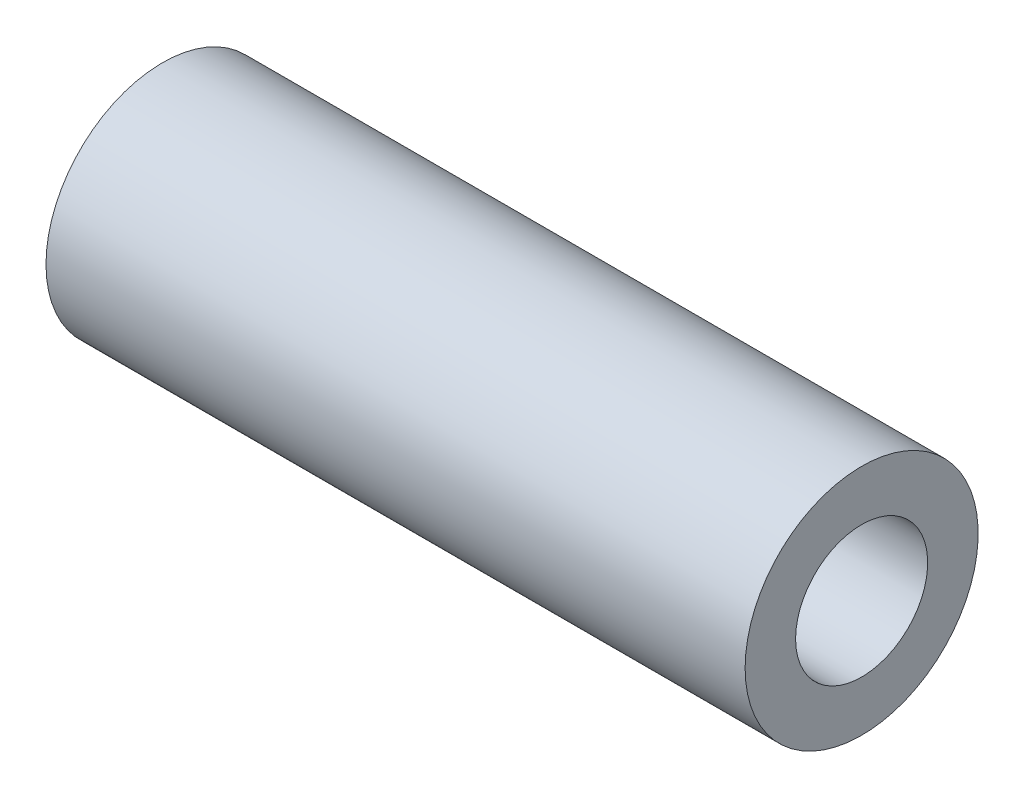
ISO-10303-21;
HEADER;
FILE_DESCRIPTION(('STEP AP214'),'2;1');
FILE_NAME('part.step','',(''),(''),'','','');
FILE_SCHEMA(('AUTOMOTIVE_DESIGN { 1 0 10303 214 1 1 1 1 }'));
ENDSEC;
DATA;
#1=APPLICATION_CONTEXT('core data for automotive mechanical design processes');
#2=APPLICATION_PROTOCOL_DEFINITION('international standard','automotive_design',2000,#1);
#3=PRODUCT_CONTEXT('',#1,'mechanical');
#4=PRODUCT('Part','Part','',(#3));
#5=PRODUCT_RELATED_PRODUCT_CATEGORY('part','',(#4));
#6=PRODUCT_DEFINITION_FORMATION('','',#4);
#7=PRODUCT_DEFINITION_CONTEXT('part definition',#1,'design');
#8=PRODUCT_DEFINITION('design','',#6,#7);
#9=PRODUCT_DEFINITION_SHAPE('','',#8);
#10=(LENGTH_UNIT() NAMED_UNIT(*) SI_UNIT(.MILLI.,.METRE.));
#11=(NAMED_UNIT(*) PLANE_ANGLE_UNIT() SI_UNIT($,.RADIAN.));
#12=(NAMED_UNIT(*) SI_UNIT($,.STERADIAN.) SOLID_ANGLE_UNIT());
#13=UNCERTAINTY_MEASURE_WITH_UNIT(LENGTH_MEASURE(1.E-05),#10,'distance_accuracy_value','');
#14=(GEOMETRIC_REPRESENTATION_CONTEXT(3) GLOBAL_UNCERTAINTY_ASSIGNED_CONTEXT((#13)) GLOBAL_UNIT_ASSIGNED_CONTEXT((#10,
#11,#12)) REPRESENTATION_CONTEXT('',''));
#15=CARTESIAN_POINT('',(0.,0.,0.));
#16=DIRECTION('',(0.,0.,1.));
#17=DIRECTION('',(1.,0.,0.));
#18=AXIS2_PLACEMENT_3D('',#15,#16,#17);
#19=CARTESIAN_POINT('',(19.05,0.,0.));
#20=DIRECTION('',(1.,0.,0.));
#21=DIRECTION('',(0.,0.,-1.));
#22=AXIS2_PLACEMENT_3D('',#19,#20,#21);
#23=PLANE('',#22);
#24=CARTESIAN_POINT('',(19.05,0.,0.));
#25=DIRECTION('',(1.,0.,0.));
#26=DIRECTION('',(0.,0.,-1.));
#27=AXIS2_PLACEMENT_3D('',#24,#25,#26);
#28=CIRCLE('',#27,3.175);
#29=CARTESIAN_POINT('',(19.05,0.,3.175));
#30=VERTEX_POINT('',#29);
#31=EDGE_CURVE('E10',#30,#30,#28,.T.);
#32=ORIENTED_EDGE('',*,*,#31,.T.);
#33=EDGE_LOOP('',(#32));
#34=FACE_BOUND('',#33,.T.);
#35=CARTESIAN_POINT('',(19.05,0.,0.));
#36=DIRECTION('',(1.,0.,0.));
#37=DIRECTION('',(0.,0.,-1.));
#38=AXIS2_PLACEMENT_3D('',#35,#36,#37);
#39=CIRCLE('',#38,1.8);
#40=CARTESIAN_POINT('',(19.05,0.,1.8));
#41=VERTEX_POINT('',#40);
#42=EDGE_CURVE('E42',#41,#41,#39,.T.);
#43=ORIENTED_EDGE('',*,*,#42,.F.);
#44=EDGE_LOOP('',(#43));
#45=FACE_BOUND('',#44,.T.);
#46=ADVANCED_FACE('F31',(#34,#45),#23,.T.);
#47=CARTESIAN_POINT('',(0.,0.,0.));
#48=DIRECTION('',(1.,0.,0.));
#49=DIRECTION('',(0.,0.,-1.));
#50=AXIS2_PLACEMENT_3D('',#47,#48,#49);
#51=PLANE('',#50);
#52=CARTESIAN_POINT('',(0.,0.,0.));
#53=DIRECTION('',(1.,0.,0.));
#54=DIRECTION('',(0.,0.,-1.));
#55=AXIS2_PLACEMENT_3D('',#52,#53,#54);
#56=CIRCLE('',#55,3.175);
#57=CARTESIAN_POINT('',(0.,0.,3.175));
#58=VERTEX_POINT('',#57);
#59=EDGE_CURVE('E35',#58,#58,#56,.T.);
#60=ORIENTED_EDGE('',*,*,#59,.F.);
#61=EDGE_LOOP('',(#60));
#62=FACE_BOUND('',#61,.T.);
#63=CARTESIAN_POINT('',(0.,0.,0.));
#64=DIRECTION('',(1.,0.,0.));
#65=DIRECTION('',(0.,0.,-1.));
#66=AXIS2_PLACEMENT_3D('',#63,#64,#65);
#67=CIRCLE('',#66,1.8);
#68=CARTESIAN_POINT('',(0.,0.,1.8));
#69=VERTEX_POINT('',#68);
#70=EDGE_CURVE('E44',#69,#69,#67,.T.);
#71=ORIENTED_EDGE('',*,*,#70,.T.);
#72=EDGE_LOOP('',(#71));
#73=FACE_BOUND('',#72,.T.);
#74=ADVANCED_FACE('F54',(#62,#73),#51,.F.);
#75=CARTESIAN_POINT('',(19.05,0.,0.));
#76=DIRECTION('',(-1.,0.,0.));
#77=DIRECTION('',(0.,0.,1.));
#78=AXIS2_PLACEMENT_3D('',#75,#76,#77);
#79=CYLINDRICAL_SURFACE('',#78,3.175);
#80=CARTESIAN_POINT('',(19.05,0.,3.175));
#81=CARTESIAN_POINT('',(18.8515625,0.,3.175));
#82=CARTESIAN_POINT('',(18.653125,0.,3.175));
#83=CARTESIAN_POINT('',(18.25625,0.,3.175));
#84=CARTESIAN_POINT('',(18.0578125,0.,3.175));
#85=CARTESIAN_POINT('',(17.6609375,0.,3.175));
#86=CARTESIAN_POINT('',(17.4625,0.,3.175));
#87=CARTESIAN_POINT('',(17.065625,0.,3.175));
#88=CARTESIAN_POINT('',(16.8671875,0.,3.175));
#89=CARTESIAN_POINT('',(16.4703125,0.,3.175));
#90=CARTESIAN_POINT('',(16.271875,0.,3.175));
#91=CARTESIAN_POINT('',(15.875,0.,3.175));
#92=CARTESIAN_POINT('',(15.6765625,0.,3.175));
#93=CARTESIAN_POINT('',(15.2796875,0.,3.175));
#94=CARTESIAN_POINT('',(15.08125,0.,3.175));
#95=CARTESIAN_POINT('',(14.684375,0.,3.175));
#96=CARTESIAN_POINT('',(14.4859375,0.,3.175));
#97=CARTESIAN_POINT('',(14.0890625,0.,3.175));
#98=CARTESIAN_POINT('',(13.890625,0.,3.175));
#99=CARTESIAN_POINT('',(13.49375,0.,3.175));
#100=CARTESIAN_POINT('',(13.2953125,0.,3.175));
#101=CARTESIAN_POINT('',(12.8984375,0.,3.175));
#102=CARTESIAN_POINT('',(12.7,0.,3.175));
#103=CARTESIAN_POINT('',(12.303125,0.,3.175));
#104=CARTESIAN_POINT('',(12.1046875,0.,3.175));
#105=CARTESIAN_POINT('',(11.7078125,0.,3.175));
#106=CARTESIAN_POINT('',(11.509375,0.,3.175));
#107=CARTESIAN_POINT('',(11.1125,0.,3.175));
#108=CARTESIAN_POINT('',(10.9140625,0.,3.175));
#109=CARTESIAN_POINT('',(10.5171875,0.,3.175));
#110=CARTESIAN_POINT('',(10.31875,0.,3.175));
#111=CARTESIAN_POINT('',(9.921875,0.,3.175));
#112=CARTESIAN_POINT('',(9.7234375,0.,3.175));
#113=CARTESIAN_POINT('',(9.3265625,0.,3.175));
#114=CARTESIAN_POINT('',(9.128125,0.,3.175));
#115=CARTESIAN_POINT('',(8.73125,0.,3.175));
#116=CARTESIAN_POINT('',(8.5328125,0.,3.175));
#117=CARTESIAN_POINT('',(8.1359375,0.,3.175));
#118=CARTESIAN_POINT('',(7.9375,0.,3.175));
#119=CARTESIAN_POINT('',(7.540625,0.,3.175));
#120=CARTESIAN_POINT('',(7.3421875,0.,3.175));
#121=CARTESIAN_POINT('',(6.9453125,0.,3.175));
#122=CARTESIAN_POINT('',(6.746875,0.,3.175));
#123=CARTESIAN_POINT('',(6.35,0.,3.175));
#124=CARTESIAN_POINT('',(6.1515625,0.,3.175));
#125=CARTESIAN_POINT('',(5.7546875,0.,3.175));
#126=CARTESIAN_POINT('',(5.55625,0.,3.175));
#127=CARTESIAN_POINT('',(5.159375,0.,3.175));
#128=CARTESIAN_POINT('',(4.9609375,0.,3.175));
#129=CARTESIAN_POINT('',(4.5640625,0.,3.175));
#130=CARTESIAN_POINT('',(4.365625,0.,3.175));
#131=CARTESIAN_POINT('',(3.96875,0.,3.175));
#132=CARTESIAN_POINT('',(3.7703125,0.,3.175));
#133=CARTESIAN_POINT('',(3.3734375,0.,3.175));
#134=CARTESIAN_POINT('',(3.175,0.,3.175));
#135=CARTESIAN_POINT('',(2.778125,0.,3.175));
#136=CARTESIAN_POINT('',(2.5796875,0.,3.175));
#137=CARTESIAN_POINT('',(2.1828125,0.,3.175));
#138=CARTESIAN_POINT('',(1.984375,0.,3.175));
#139=CARTESIAN_POINT('',(1.5875,0.,3.175));
#140=CARTESIAN_POINT('',(1.3890625,0.,3.175));
#141=CARTESIAN_POINT('',(0.992187500000001,0.,3.175));
#142=CARTESIAN_POINT('',(0.793750000000001,0.,3.175));
#143=CARTESIAN_POINT('',(0.396875,0.,3.175));
#144=CARTESIAN_POINT('',(0.1984375,0.,3.175));
#145=CARTESIAN_POINT('',(0.,0.,3.175));
#146=B_SPLINE_CURVE_WITH_KNOTS('',3,(#80,#81,#82,#83,#84,#85,#86,#87,#88,#89,#90,#91,#92,#93,
#94,#95,#96,#97,#98,#99,#100,#101,#102,#103,#104,#105,#106,#107,#108,#109,#110,#111,#112,#113,
#114,#115,#116,#117,#118,#119,#120,#121,#122,#123,#124,#125,#126,#127,#128,#129,#130,#131,#132,
#133,#134,#135,#136,#137,#138,#139,#140,#141,#142,#143,#144,#145),.UNSPECIFIED.,.F.,.F.,(4,2,2,
2,2,2,2,2,2,2,2,2,2,2,2,2,2,2,2,2,2,2,2,2,2,2,2,2,2,2,2,2,4),(0.,0.595312499999997,1.190625,
1.7859375,2.38125,2.9765625,3.571875,4.1671875,4.7625,5.3578125,5.953125,6.5484375,7.14375,
7.7390625,8.334375,8.9296875,9.525,10.1203125,10.715625,11.3109375,11.90625,12.5015625,
13.096875,13.6921875,14.2875,14.8828125,15.478125,16.0734375,16.66875,17.2640625,17.859375,
18.4546875,19.05),.UNSPECIFIED.);
#147=EDGE_CURVE('BSEAM33',#30,#58,#146,.T.);
#148=ORIENTED_EDGE('',*,*,#31,.F.);
#149=ORIENTED_EDGE('',*,*,#59,.T.);
#150=ORIENTED_EDGE('',*,*,#147,.T.);
#151=ORIENTED_EDGE('',*,*,#147,.F.);
#152=EDGE_LOOP('',(#148,#150,#149,#151));
#153=FACE_BOUND('',#152,.T.);
#154=ADVANCED_FACE('F33',(#153),#79,.T.);
#155=CARTESIAN_POINT('',(19.05,0.,0.));
#156=DIRECTION('',(-1.,0.,0.));
#157=DIRECTION('',(0.,0.,1.));
#158=AXIS2_PLACEMENT_3D('',#155,#156,#157);
#159=CYLINDRICAL_SURFACE('',#158,1.8);
#160=CARTESIAN_POINT('',(19.05,0.,1.8));
#161=CARTESIAN_POINT('',(18.8515625,0.,1.8));
#162=CARTESIAN_POINT('',(18.653125,0.,1.8));
#163=CARTESIAN_POINT('',(18.25625,0.,1.8));
#164=CARTESIAN_POINT('',(18.0578125,0.,1.8));
#165=CARTESIAN_POINT('',(17.6609375,0.,1.8));
#166=CARTESIAN_POINT('',(17.4625,0.,1.8));
#167=CARTESIAN_POINT('',(17.065625,0.,1.8));
#168=CARTESIAN_POINT('',(16.8671875,0.,1.8));
#169=CARTESIAN_POINT('',(16.4703125,0.,1.8));
#170=CARTESIAN_POINT('',(16.271875,0.,1.8));
#171=CARTESIAN_POINT('',(15.875,0.,1.8));
#172=CARTESIAN_POINT('',(15.6765625,0.,1.8));
#173=CARTESIAN_POINT('',(15.2796875,0.,1.8));
#174=CARTESIAN_POINT('',(15.08125,0.,1.8));
#175=CARTESIAN_POINT('',(14.684375,0.,1.8));
#176=CARTESIAN_POINT('',(14.4859375,0.,1.8));
#177=CARTESIAN_POINT('',(14.0890625,0.,1.8));
#178=CARTESIAN_POINT('',(13.890625,0.,1.8));
#179=CARTESIAN_POINT('',(13.49375,0.,1.8));
#180=CARTESIAN_POINT('',(13.2953125,0.,1.8));
#181=CARTESIAN_POINT('',(12.8984375,0.,1.8));
#182=CARTESIAN_POINT('',(12.7,0.,1.8));
#183=CARTESIAN_POINT('',(12.303125,0.,1.8));
#184=CARTESIAN_POINT('',(12.1046875,0.,1.8));
#185=CARTESIAN_POINT('',(11.7078125,0.,1.8));
#186=CARTESIAN_POINT('',(11.509375,0.,1.8));
#187=CARTESIAN_POINT('',(11.1125,0.,1.8));
#188=CARTESIAN_POINT('',(10.9140625,0.,1.8));
#189=CARTESIAN_POINT('',(10.5171875,0.,1.8));
#190=CARTESIAN_POINT('',(10.31875,0.,1.8));
#191=CARTESIAN_POINT('',(9.921875,0.,1.8));
#192=CARTESIAN_POINT('',(9.7234375,0.,1.8));
#193=CARTESIAN_POINT('',(9.3265625,0.,1.8));
#194=CARTESIAN_POINT('',(9.128125,0.,1.8));
#195=CARTESIAN_POINT('',(8.73125,0.,1.8));
#196=CARTESIAN_POINT('',(8.5328125,0.,1.8));
#197=CARTESIAN_POINT('',(8.1359375,0.,1.8));
#198=CARTESIAN_POINT('',(7.9375,0.,1.8));
#199=CARTESIAN_POINT('',(7.540625,0.,1.8));
#200=CARTESIAN_POINT('',(7.3421875,0.,1.8));
#201=CARTESIAN_POINT('',(6.9453125,0.,1.8));
#202=CARTESIAN_POINT('',(6.746875,0.,1.8));
#203=CARTESIAN_POINT('',(6.35,0.,1.8));
#204=CARTESIAN_POINT('',(6.1515625,0.,1.8));
#205=CARTESIAN_POINT('',(5.7546875,0.,1.8));
#206=CARTESIAN_POINT('',(5.55625,0.,1.8));
#207=CARTESIAN_POINT('',(5.159375,0.,1.8));
#208=CARTESIAN_POINT('',(4.9609375,0.,1.8));
#209=CARTESIAN_POINT('',(4.5640625,0.,1.8));
#210=CARTESIAN_POINT('',(4.365625,0.,1.8));
#211=CARTESIAN_POINT('',(3.96875,0.,1.8));
#212=CARTESIAN_POINT('',(3.7703125,0.,1.8));
#213=CARTESIAN_POINT('',(3.3734375,0.,1.8));
#214=CARTESIAN_POINT('',(3.175,0.,1.8));
#215=CARTESIAN_POINT('',(2.778125,0.,1.8));
#216=CARTESIAN_POINT('',(2.5796875,0.,1.8));
#217=CARTESIAN_POINT('',(2.1828125,0.,1.8));
#218=CARTESIAN_POINT('',(1.984375,0.,1.8));
#219=CARTESIAN_POINT('',(1.5875,0.,1.8));
#220=CARTESIAN_POINT('',(1.3890625,0.,1.8));
#221=CARTESIAN_POINT('',(0.992187500000001,0.,1.8));
#222=CARTESIAN_POINT('',(0.793750000000001,0.,1.8));
#223=CARTESIAN_POINT('',(0.396875,0.,1.8));
#224=CARTESIAN_POINT('',(0.1984375,0.,1.8));
#225=CARTESIAN_POINT('',(0.,0.,1.8));
#226=B_SPLINE_CURVE_WITH_KNOTS('',3,(#160,#161,#162,#163,#164,#165,#166,#167,#168,#169,#170,
#171,#172,#173,#174,#175,#176,#177,#178,#179,#180,#181,#182,#183,#184,#185,#186,#187,#188,#189,
#190,#191,#192,#193,#194,#195,#196,#197,#198,#199,#200,#201,#202,#203,#204,#205,#206,#207,#208,
#209,#210,#211,#212,#213,#214,#215,#216,#217,#218,#219,#220,#221,#222,#223,#224,#225),
.UNSPECIFIED.,.F.,.F.,(4,2,2,2,2,2,2,2,2,2,2,2,2,2,2,2,2,2,2,2,2,2,2,2,2,2,2,2,2,2,2,2,4),(0.,
0.5953125,1.190625,1.7859375,2.38125,2.9765625,3.571875,4.1671875,4.7625,5.3578125,5.953125,
6.5484375,7.14375,7.7390625,8.334375,8.9296875,9.525,10.1203125,10.715625,11.3109375,11.90625,
12.5015625,13.096875,13.6921875,14.2875,14.8828125,15.478125,16.0734375,16.66875,17.2640625,
17.859375,18.4546875,19.05),.UNSPECIFIED.);
#227=EDGE_CURVE('BSEAM50',#41,#69,#226,.T.);
#228=ORIENTED_EDGE('',*,*,#42,.T.);
#229=ORIENTED_EDGE('',*,*,#70,.F.);
#230=ORIENTED_EDGE('',*,*,#227,.T.);
#231=ORIENTED_EDGE('',*,*,#227,.F.);
#232=EDGE_LOOP('',(#228,#230,#229,#231));
#233=FACE_BOUND('',#232,.T.);
#234=ADVANCED_FACE('F50',(#233),#159,.F.);
#235=CLOSED_SHELL('',(#46,#74,#154,#234));
#236=MANIFOLD_SOLID_BREP('B2',#235);
#237=ADVANCED_BREP_SHAPE_REPRESENTATION('',(#18,#236),#14);
#238=SHAPE_DEFINITION_REPRESENTATION(#9,#237);
ENDSEC;
END-ISO-10303-21;
